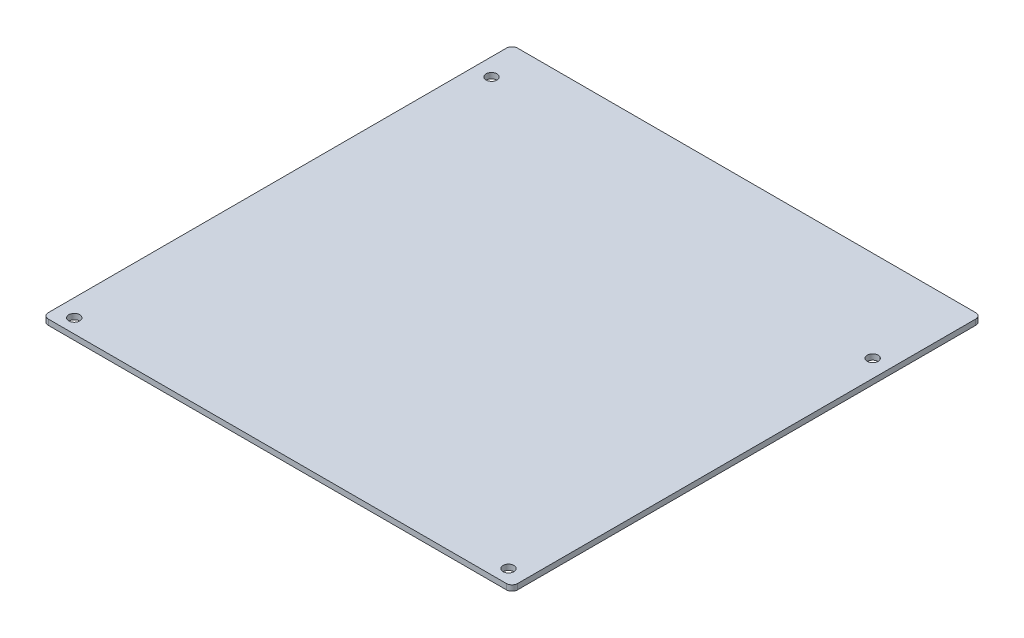
ISO-10303-21;
HEADER;
FILE_DESCRIPTION(('STEP AP214'),'2;1');
FILE_NAME('part.step','',(''),(''),'','','');
FILE_SCHEMA(('AUTOMOTIVE_DESIGN { 1 0 10303 214 1 1 1 1 }'));
ENDSEC;
DATA;
#1=APPLICATION_CONTEXT('core data for automotive mechanical design processes');
#2=APPLICATION_PROTOCOL_DEFINITION('international standard','automotive_design',2000,#1);
#3=PRODUCT_CONTEXT('',#1,'mechanical');
#4=PRODUCT('Part','Part','',(#3));
#5=PRODUCT_RELATED_PRODUCT_CATEGORY('part','',(#4));
#6=PRODUCT_DEFINITION_FORMATION('','',#4);
#7=PRODUCT_DEFINITION_CONTEXT('part definition',#1,'design');
#8=PRODUCT_DEFINITION('design','',#6,#7);
#9=PRODUCT_DEFINITION_SHAPE('','',#8);
#10=(LENGTH_UNIT() NAMED_UNIT(*) SI_UNIT(.MILLI.,.METRE.));
#11=(NAMED_UNIT(*) PLANE_ANGLE_UNIT() SI_UNIT($,.RADIAN.));
#12=(NAMED_UNIT(*) SI_UNIT($,.STERADIAN.) SOLID_ANGLE_UNIT());
#13=UNCERTAINTY_MEASURE_WITH_UNIT(LENGTH_MEASURE(1.E-05),#10,'distance_accuracy_value','');
#14=(GEOMETRIC_REPRESENTATION_CONTEXT(3) GLOBAL_UNCERTAINTY_ASSIGNED_CONTEXT((#13)) GLOBAL_UNIT_ASSIGNED_CONTEXT((#10,
#11,#12)) REPRESENTATION_CONTEXT('',''));
#15=CARTESIAN_POINT('',(0.,0.,0.));
#16=DIRECTION('',(0.,0.,1.));
#17=DIRECTION('',(1.,0.,0.));
#18=AXIS2_PLACEMENT_3D('',#15,#16,#17);
#19=CARTESIAN_POINT('',(85.09,2.,85.09));
#20=DIRECTION('',(-1.,0.,0.));
#21=DIRECTION('',(0.,0.,1.));
#22=AXIS2_PLACEMENT_3D('',#19,#20,#21);
#23=PLANE('',#22);
#24=DIRECTION('',(0.,0.,-1.));
#25=VECTOR('',#24,1.);
#26=CARTESIAN_POINT('',(85.09,0.,85.09));
#27=LINE('',#26,#25);
#28=CARTESIAN_POINT('',(85.09,0.,83.09));
#29=VERTEX_POINT('',#28);
#30=CARTESIAN_POINT('',(85.09,0.,-83.09));
#31=VERTEX_POINT('',#30);
#32=EDGE_CURVE('E128',#29,#31,#27,.T.);
#33=ORIENTED_EDGE('',*,*,#32,.T.);
#34=DIRECTION('',(0.,-1.,0.));
#35=VECTOR('',#34,1.);
#36=CARTESIAN_POINT('',(85.09,2.,-83.09));
#37=LINE('',#36,#35);
#38=CARTESIAN_POINT('',(85.09,2.,-83.09));
#39=VERTEX_POINT('',#38);
#40=EDGE_CURVE('E151',#31,#39,#37,.F.);
#41=ORIENTED_EDGE('',*,*,#40,.T.);
#42=DIRECTION('',(0.,0.,-1.));
#43=VECTOR('',#42,1.);
#44=CARTESIAN_POINT('',(85.09,2.,85.09));
#45=LINE('',#44,#43);
#46=CARTESIAN_POINT('',(85.09,2.,83.09));
#47=VERTEX_POINT('',#46);
#48=EDGE_CURVE('E126',#47,#39,#45,.T.);
#49=ORIENTED_EDGE('',*,*,#48,.F.);
#50=DIRECTION('',(0.,-1.,0.));
#51=VECTOR('',#50,1.);
#52=CARTESIAN_POINT('',(85.09,2.,83.09));
#53=LINE('',#52,#51);
#54=EDGE_CURVE('E148',#47,#29,#53,.T.);
#55=ORIENTED_EDGE('',*,*,#54,.T.);
#56=EDGE_LOOP('',(#33,#41,#49,#55));
#57=FACE_BOUND('',#56,.T.);
#58=ADVANCED_FACE('F33',(#57),#23,.F.);
#59=CARTESIAN_POINT('',(-85.09,2.,-85.09));
#60=DIRECTION('',(0.,0.,1.));
#61=DIRECTION('',(1.,0.,0.));
#62=AXIS2_PLACEMENT_3D('',#59,#60,#61);
#63=PLANE('',#62);
#64=DIRECTION('',(-1.,0.,0.));
#65=VECTOR('',#64,1.);
#66=CARTESIAN_POINT('',(-85.09,0.,-85.09));
#67=LINE('',#66,#65);
#68=CARTESIAN_POINT('',(83.09,0.,-85.09));
#69=VERTEX_POINT('',#68);
#70=CARTESIAN_POINT('',(-83.09,0.,-85.09));
#71=VERTEX_POINT('',#70);
#72=EDGE_CURVE('E124',#69,#71,#67,.T.);
#73=ORIENTED_EDGE('',*,*,#72,.T.);
#74=DIRECTION('',(0.,-1.,0.));
#75=VECTOR('',#74,1.);
#76=CARTESIAN_POINT('',(-83.09,2.,-85.09));
#77=LINE('',#76,#75);
#78=CARTESIAN_POINT('',(-83.09,2.,-85.09));
#79=VERTEX_POINT('',#78);
#80=EDGE_CURVE('E103',#71,#79,#77,.F.);
#81=ORIENTED_EDGE('',*,*,#80,.T.);
#82=DIRECTION('',(-1.,0.,0.));
#83=VECTOR('',#82,1.);
#84=CARTESIAN_POINT('',(-85.09,2.,-85.09));
#85=LINE('',#84,#83);
#86=CARTESIAN_POINT('',(83.09,2.,-85.09));
#87=VERTEX_POINT('',#86);
#88=EDGE_CURVE('E167',#87,#79,#85,.T.);
#89=ORIENTED_EDGE('',*,*,#88,.F.);
#90=DIRECTION('',(0.,-1.,0.));
#91=VECTOR('',#90,1.);
#92=CARTESIAN_POINT('',(83.09,2.,-85.09));
#93=LINE('',#92,#91);
#94=EDGE_CURVE('E108',#87,#69,#93,.T.);
#95=ORIENTED_EDGE('',*,*,#94,.T.);
#96=EDGE_LOOP('',(#73,#81,#89,#95));
#97=FACE_BOUND('',#96,.T.);
#98=ADVANCED_FACE('F212',(#97),#63,.F.);
#99=CARTESIAN_POINT('',(-85.09,2.,85.09));
#100=DIRECTION('',(1.,0.,0.));
#101=DIRECTION('',(0.,0.,-1.));
#102=AXIS2_PLACEMENT_3D('',#99,#100,#101);
#103=PLANE('',#102);
#104=DIRECTION('',(0.,0.,1.));
#105=VECTOR('',#104,1.);
#106=CARTESIAN_POINT('',(-85.09,2.,85.09));
#107=LINE('',#106,#105);
#108=CARTESIAN_POINT('',(-85.09,2.,-83.09));
#109=VERTEX_POINT('',#108);
#110=CARTESIAN_POINT('',(-85.09,2.,83.09));
#111=VERTEX_POINT('',#110);
#112=EDGE_CURVE('E117',#109,#111,#107,.T.);
#113=ORIENTED_EDGE('',*,*,#112,.F.);
#114=DIRECTION('',(0.,-1.,0.));
#115=VECTOR('',#114,1.);
#116=CARTESIAN_POINT('',(-85.09,2.,-83.09));
#117=LINE('',#116,#115);
#118=CARTESIAN_POINT('',(-85.09,0.,-83.09));
#119=VERTEX_POINT('',#118);
#120=EDGE_CURVE('E102',#109,#119,#117,.T.);
#121=ORIENTED_EDGE('',*,*,#120,.T.);
#122=DIRECTION('',(0.,0.,1.));
#123=VECTOR('',#122,1.);
#124=CARTESIAN_POINT('',(-85.09,0.,85.09));
#125=LINE('',#124,#123);
#126=CARTESIAN_POINT('',(-85.09,0.,83.09));
#127=VERTEX_POINT('',#126);
#128=EDGE_CURVE('E115',#119,#127,#125,.T.);
#129=ORIENTED_EDGE('',*,*,#128,.T.);
#130=DIRECTION('',(0.,-1.,0.));
#131=VECTOR('',#130,1.);
#132=CARTESIAN_POINT('',(-85.09,2.,83.09));
#133=LINE('',#132,#131);
#134=EDGE_CURVE('E119',#127,#111,#133,.F.);
#135=ORIENTED_EDGE('',*,*,#134,.T.);
#136=EDGE_LOOP('',(#113,#121,#129,#135));
#137=FACE_BOUND('',#136,.T.);
#138=ADVANCED_FACE('F114',(#137),#103,.F.);
#139=CARTESIAN_POINT('',(-85.09,2.,85.09));
#140=DIRECTION('',(0.,0.,-1.));
#141=DIRECTION('',(-1.,0.,0.));
#142=AXIS2_PLACEMENT_3D('',#139,#140,#141);
#143=PLANE('',#142);
#144=DIRECTION('',(1.,0.,0.));
#145=VECTOR('',#144,1.);
#146=CARTESIAN_POINT('',(-85.09,0.,85.09));
#147=LINE('',#146,#145);
#148=CARTESIAN_POINT('',(-83.09,0.,85.09));
#149=VERTEX_POINT('',#148);
#150=CARTESIAN_POINT('',(83.09,0.,85.09));
#151=VERTEX_POINT('',#150);
#152=EDGE_CURVE('E123',#149,#151,#147,.T.);
#153=ORIENTED_EDGE('',*,*,#152,.T.);
#154=DIRECTION('',(0.,-1.,0.));
#155=VECTOR('',#154,1.);
#156=CARTESIAN_POINT('',(83.09,2.,85.09));
#157=LINE('',#156,#155);
#158=CARTESIAN_POINT('',(83.09,2.,85.09));
#159=VERTEX_POINT('',#158);
#160=EDGE_CURVE('E11',#151,#159,#157,.F.);
#161=ORIENTED_EDGE('',*,*,#160,.T.);
#162=DIRECTION('',(1.,0.,0.));
#163=VECTOR('',#162,1.);
#164=CARTESIAN_POINT('',(-85.09,2.,85.09));
#165=LINE('',#164,#163);
#166=CARTESIAN_POINT('',(-83.09,2.,85.09));
#167=VERTEX_POINT('',#166);
#168=EDGE_CURVE('E132',#167,#159,#165,.T.);
#169=ORIENTED_EDGE('',*,*,#168,.F.);
#170=DIRECTION('',(0.,-1.,0.));
#171=VECTOR('',#170,1.);
#172=CARTESIAN_POINT('',(-83.09,2.,85.09));
#173=LINE('',#172,#171);
#174=EDGE_CURVE('E41',#167,#149,#173,.T.);
#175=ORIENTED_EDGE('',*,*,#174,.T.);
#176=EDGE_LOOP('',(#153,#161,#169,#175));
#177=FACE_BOUND('',#176,.T.);
#178=ADVANCED_FACE('F154',(#177),#143,.F.);
#179=CARTESIAN_POINT('',(0.,2.,0.));
#180=DIRECTION('',(0.,-1.,0.));
#181=DIRECTION('',(0.,0.,-1.));
#182=AXIS2_PLACEMENT_3D('',#179,#180,#181);
#183=PLANE('',#182);
#184=CARTESIAN_POINT('',(-78.74,2.,-71.3215962110521));
#185=DIRECTION('',(0.,1.,0.));
#186=DIRECTION('',(0.,0.,1.));
#187=AXIS2_PLACEMENT_3D('',#184,#185,#186);
#188=CIRCLE('',#187,1.97500000000001);
#189=CARTESIAN_POINT('',(-78.74,2.,-69.3465962110521));
#190=VERTEX_POINT('',#189);
#191=EDGE_CURVE('E178',#190,#190,#188,.T.);
#192=ORIENTED_EDGE('',*,*,#191,.F.);
#193=EDGE_LOOP('',(#192));
#194=FACE_BOUND('',#193,.T.);
#195=CARTESIAN_POINT('',(78.74,2.,-52.07));
#196=DIRECTION('',(0.,1.,0.));
#197=DIRECTION('',(0.,0.,1.));
#198=AXIS2_PLACEMENT_3D('',#195,#196,#197);
#199=CIRCLE('',#198,1.97500000000001);
#200=CARTESIAN_POINT('',(78.74,2.,-50.095));
#201=VERTEX_POINT('',#200);
#202=EDGE_CURVE('E188',#201,#201,#199,.T.);
#203=ORIENTED_EDGE('',*,*,#202,.F.);
#204=EDGE_LOOP('',(#203));
#205=FACE_BOUND('',#204,.T.);
#206=CARTESIAN_POINT('',(78.74,2.,80.01));
#207=DIRECTION('',(0.,1.,0.));
#208=DIRECTION('',(0.,0.,1.));
#209=AXIS2_PLACEMENT_3D('',#206,#207,#208);
#210=CIRCLE('',#209,1.97500000000001);
#211=CARTESIAN_POINT('',(78.74,2.,81.985));
#212=VERTEX_POINT('',#211);
#213=EDGE_CURVE('E194',#212,#212,#210,.T.);
#214=ORIENTED_EDGE('',*,*,#213,.F.);
#215=EDGE_LOOP('',(#214));
#216=FACE_BOUND('',#215,.T.);
#217=CARTESIAN_POINT('',(-78.74,2.,80.01));
#218=DIRECTION('',(0.,1.,0.));
#219=DIRECTION('',(0.,0.,1.));
#220=AXIS2_PLACEMENT_3D('',#217,#218,#219);
#221=CIRCLE('',#220,1.97500000000001);
#222=CARTESIAN_POINT('',(-78.74,2.,81.985));
#223=VERTEX_POINT('',#222);
#224=EDGE_CURVE('E172',#223,#223,#221,.T.);
#225=ORIENTED_EDGE('',*,*,#224,.F.);
#226=EDGE_LOOP('',(#225));
#227=FACE_BOUND('',#226,.T.);
#228=ORIENTED_EDGE('',*,*,#88,.T.);
#229=CARTESIAN_POINT('',(-83.09,2.,-83.09));
#230=DIRECTION('',(0.,-1.,0.));
#231=DIRECTION('',(0.,0.,-1.));
#232=AXIS2_PLACEMENT_3D('',#229,#230,#231);
#233=CIRCLE('',#232,2.);
#234=EDGE_CURVE('E146',#79,#109,#233,.F.);
#235=ORIENTED_EDGE('',*,*,#234,.T.);
#236=ORIENTED_EDGE('',*,*,#112,.T.);
#237=CARTESIAN_POINT('',(-83.09,2.,83.09));
#238=DIRECTION('',(0.,-1.,0.));
#239=DIRECTION('',(0.,0.,-1.));
#240=AXIS2_PLACEMENT_3D('',#237,#238,#239);
#241=CIRCLE('',#240,2.);
#242=EDGE_CURVE('E53',#111,#167,#241,.F.);
#243=ORIENTED_EDGE('',*,*,#242,.T.);
#244=ORIENTED_EDGE('',*,*,#168,.T.);
#245=CARTESIAN_POINT('',(83.09,2.,83.09));
#246=DIRECTION('',(0.,-1.,0.));
#247=DIRECTION('',(0.,0.,-1.));
#248=AXIS2_PLACEMENT_3D('',#245,#246,#247);
#249=CIRCLE('',#248,2.);
#250=EDGE_CURVE('E142',#159,#47,#249,.F.);
#251=ORIENTED_EDGE('',*,*,#250,.T.);
#252=ORIENTED_EDGE('',*,*,#48,.T.);
#253=CARTESIAN_POINT('',(83.09,2.,-83.09));
#254=DIRECTION('',(0.,-1.,0.));
#255=DIRECTION('',(0.,0.,-1.));
#256=AXIS2_PLACEMENT_3D('',#253,#254,#255);
#257=CIRCLE('',#256,2.);
#258=EDGE_CURVE('E144',#39,#87,#257,.F.);
#259=ORIENTED_EDGE('',*,*,#258,.T.);
#260=EDGE_LOOP('',(#228,#235,#236,#243,#244,#251,#252,#259));
#261=FACE_BOUND('',#260,.T.);
#262=ADVANCED_FACE('F205',(#194,#205,#216,#227,#261),#183,.F.);
#263=CARTESIAN_POINT('',(0.,0.,0.));
#264=DIRECTION('',(0.,-1.,0.));
#265=DIRECTION('',(0.,0.,-1.));
#266=AXIS2_PLACEMENT_3D('',#263,#264,#265);
#267=PLANE('',#266);
#268=CARTESIAN_POINT('',(-78.74,0.,-71.3215962110521));
#269=DIRECTION('',(0.,1.,0.));
#270=DIRECTION('',(0.,0.,1.));
#271=AXIS2_PLACEMENT_3D('',#268,#269,#270);
#272=CIRCLE('',#271,1.97500000000001);
#273=CARTESIAN_POINT('',(-78.74,0.,-69.3465962110521));
#274=VERTEX_POINT('',#273);
#275=EDGE_CURVE('E176',#274,#274,#272,.T.);
#276=ORIENTED_EDGE('',*,*,#275,.T.);
#277=EDGE_LOOP('',(#276));
#278=FACE_BOUND('',#277,.T.);
#279=CARTESIAN_POINT('',(78.74,0.,-52.07));
#280=DIRECTION('',(0.,1.,0.));
#281=DIRECTION('',(0.,0.,1.));
#282=AXIS2_PLACEMENT_3D('',#279,#280,#281);
#283=CIRCLE('',#282,1.97500000000001);
#284=CARTESIAN_POINT('',(78.74,0.,-50.095));
#285=VERTEX_POINT('',#284);
#286=EDGE_CURVE('E183',#285,#285,#283,.T.);
#287=ORIENTED_EDGE('',*,*,#286,.T.);
#288=EDGE_LOOP('',(#287));
#289=FACE_BOUND('',#288,.T.);
#290=CARTESIAN_POINT('',(78.74,0.,80.01));
#291=DIRECTION('',(0.,1.,0.));
#292=DIRECTION('',(0.,0.,1.));
#293=AXIS2_PLACEMENT_3D('',#290,#291,#292);
#294=CIRCLE('',#293,1.97500000000001);
#295=CARTESIAN_POINT('',(78.74,0.,81.985));
#296=VERTEX_POINT('',#295);
#297=EDGE_CURVE('E191',#296,#296,#294,.T.);
#298=ORIENTED_EDGE('',*,*,#297,.T.);
#299=EDGE_LOOP('',(#298));
#300=FACE_BOUND('',#299,.T.);
#301=CARTESIAN_POINT('',(-78.74,0.,80.01));
#302=DIRECTION('',(0.,1.,0.));
#303=DIRECTION('',(0.,0.,1.));
#304=AXIS2_PLACEMENT_3D('',#301,#302,#303);
#305=CIRCLE('',#304,1.97500000000001);
#306=CARTESIAN_POINT('',(-78.74,0.,81.985));
#307=VERTEX_POINT('',#306);
#308=EDGE_CURVE('E196',#307,#307,#305,.T.);
#309=ORIENTED_EDGE('',*,*,#308,.T.);
#310=EDGE_LOOP('',(#309));
#311=FACE_BOUND('',#310,.T.);
#312=ORIENTED_EDGE('',*,*,#128,.F.);
#313=CARTESIAN_POINT('',(-83.09,0.,-83.09));
#314=DIRECTION('',(0.,-1.,0.));
#315=DIRECTION('',(0.,0.,-1.));
#316=AXIS2_PLACEMENT_3D('',#313,#314,#315);
#317=CIRCLE('',#316,2.);
#318=EDGE_CURVE('E98',#119,#71,#317,.T.);
#319=ORIENTED_EDGE('',*,*,#318,.T.);
#320=ORIENTED_EDGE('',*,*,#72,.F.);
#321=CARTESIAN_POINT('',(83.09,0.,-83.09));
#322=DIRECTION('',(0.,-1.,0.));
#323=DIRECTION('',(0.,0.,-1.));
#324=AXIS2_PLACEMENT_3D('',#321,#322,#323);
#325=CIRCLE('',#324,2.);
#326=EDGE_CURVE('E109',#69,#31,#325,.T.);
#327=ORIENTED_EDGE('',*,*,#326,.T.);
#328=ORIENTED_EDGE('',*,*,#32,.F.);
#329=CARTESIAN_POINT('',(83.09,0.,83.09));
#330=DIRECTION('',(0.,-1.,0.));
#331=DIRECTION('',(0.,0.,-1.));
#332=AXIS2_PLACEMENT_3D('',#329,#330,#331);
#333=CIRCLE('',#332,2.);
#334=EDGE_CURVE('E135',#29,#151,#333,.T.);
#335=ORIENTED_EDGE('',*,*,#334,.T.);
#336=ORIENTED_EDGE('',*,*,#152,.F.);
#337=CARTESIAN_POINT('',(-83.09,0.,83.09));
#338=DIRECTION('',(0.,-1.,0.));
#339=DIRECTION('',(0.,0.,-1.));
#340=AXIS2_PLACEMENT_3D('',#337,#338,#339);
#341=CIRCLE('',#340,2.);
#342=EDGE_CURVE('E118',#149,#127,#341,.T.);
#343=ORIENTED_EDGE('',*,*,#342,.T.);
#344=EDGE_LOOP('',(#312,#319,#320,#327,#328,#335,#336,#343));
#345=FACE_BOUND('',#344,.T.);
#346=ADVANCED_FACE('F121',(#278,#289,#300,#311,#345),#267,.T.);
#347=CARTESIAN_POINT('',(-83.09,2.,-83.09));
#348=DIRECTION('',(0.,-1.,0.));
#349=DIRECTION('',(0.,0.,-1.));
#350=AXIS2_PLACEMENT_3D('',#347,#348,#349);
#351=CYLINDRICAL_SURFACE('',#350,2.);
#352=ORIENTED_EDGE('',*,*,#234,.F.);
#353=ORIENTED_EDGE('',*,*,#80,.F.);
#354=ORIENTED_EDGE('',*,*,#318,.F.);
#355=ORIENTED_EDGE('',*,*,#120,.F.);
#356=EDGE_LOOP('',(#352,#353,#354,#355));
#357=FACE_BOUND('',#356,.T.);
#358=ADVANCED_FACE('F101',(#357),#351,.T.);
#359=CARTESIAN_POINT('',(83.09,2.,-83.09));
#360=DIRECTION('',(0.,-1.,0.));
#361=DIRECTION('',(0.,0.,-1.));
#362=AXIS2_PLACEMENT_3D('',#359,#360,#361);
#363=CYLINDRICAL_SURFACE('',#362,2.);
#364=ORIENTED_EDGE('',*,*,#258,.F.);
#365=ORIENTED_EDGE('',*,*,#40,.F.);
#366=ORIENTED_EDGE('',*,*,#326,.F.);
#367=ORIENTED_EDGE('',*,*,#94,.F.);
#368=EDGE_LOOP('',(#364,#365,#366,#367));
#369=FACE_BOUND('',#368,.T.);
#370=ADVANCED_FACE('F214',(#369),#363,.T.);
#371=CARTESIAN_POINT('',(83.09,2.,83.09));
#372=DIRECTION('',(0.,-1.,0.));
#373=DIRECTION('',(0.,0.,-1.));
#374=AXIS2_PLACEMENT_3D('',#371,#372,#373);
#375=CYLINDRICAL_SURFACE('',#374,2.);
#376=ORIENTED_EDGE('',*,*,#250,.F.);
#377=ORIENTED_EDGE('',*,*,#160,.F.);
#378=ORIENTED_EDGE('',*,*,#334,.F.);
#379=ORIENTED_EDGE('',*,*,#54,.F.);
#380=EDGE_LOOP('',(#376,#377,#378,#379));
#381=FACE_BOUND('',#380,.T.);
#382=ADVANCED_FACE('F161',(#381),#375,.T.);
#383=CARTESIAN_POINT('',(-83.09,2.,83.09));
#384=DIRECTION('',(0.,-1.,0.));
#385=DIRECTION('',(0.,0.,-1.));
#386=AXIS2_PLACEMENT_3D('',#383,#384,#385);
#387=CYLINDRICAL_SURFACE('',#386,2.);
#388=ORIENTED_EDGE('',*,*,#242,.F.);
#389=ORIENTED_EDGE('',*,*,#134,.F.);
#390=ORIENTED_EDGE('',*,*,#342,.F.);
#391=ORIENTED_EDGE('',*,*,#174,.F.);
#392=EDGE_LOOP('',(#388,#389,#390,#391));
#393=FACE_BOUND('',#392,.T.);
#394=ADVANCED_FACE('F35',(#393),#387,.T.);
#395=CARTESIAN_POINT('',(-78.74,0.,80.01));
#396=DIRECTION('',(0.,1.,0.));
#397=DIRECTION('',(0.,0.,1.));
#398=AXIS2_PLACEMENT_3D('',#395,#396,#397);
#399=CYLINDRICAL_SURFACE('',#398,1.97500000000001);
#400=ORIENTED_EDGE('',*,*,#308,.F.);
#401=EDGE_LOOP('',(#400));
#402=FACE_BOUND('',#401,.T.);
#403=ORIENTED_EDGE('',*,*,#224,.T.);
#404=EDGE_LOOP('',(#403));
#405=FACE_BOUND('',#404,.T.);
#406=ADVANCED_FACE('F203',(#402,#405),#399,.F.);
#407=CARTESIAN_POINT('',(78.74,0.,80.01));
#408=DIRECTION('',(0.,1.,0.));
#409=DIRECTION('',(0.,0.,1.));
#410=AXIS2_PLACEMENT_3D('',#407,#408,#409);
#411=CYLINDRICAL_SURFACE('',#410,1.97500000000001);
#412=ORIENTED_EDGE('',*,*,#297,.F.);
#413=EDGE_LOOP('',(#412));
#414=FACE_BOUND('',#413,.T.);
#415=ORIENTED_EDGE('',*,*,#213,.T.);
#416=EDGE_LOOP('',(#415));
#417=FACE_BOUND('',#416,.T.);
#418=ADVANCED_FACE('F237',(#414,#417),#411,.F.);
#419=CARTESIAN_POINT('',(78.74,0.,-52.07));
#420=DIRECTION('',(0.,1.,0.));
#421=DIRECTION('',(0.,0.,1.));
#422=AXIS2_PLACEMENT_3D('',#419,#420,#421);
#423=CYLINDRICAL_SURFACE('',#422,1.97500000000001);
#424=ORIENTED_EDGE('',*,*,#286,.F.);
#425=EDGE_LOOP('',(#424));
#426=FACE_BOUND('',#425,.T.);
#427=ORIENTED_EDGE('',*,*,#202,.T.);
#428=EDGE_LOOP('',(#427));
#429=FACE_BOUND('',#428,.T.);
#430=ADVANCED_FACE('F241',(#426,#429),#423,.F.);
#431=CARTESIAN_POINT('',(-78.74,0.,-71.3215962110521));
#432=DIRECTION('',(0.,1.,0.));
#433=DIRECTION('',(0.,0.,1.));
#434=AXIS2_PLACEMENT_3D('',#431,#432,#433);
#435=CYLINDRICAL_SURFACE('',#434,1.97500000000001);
#436=ORIENTED_EDGE('',*,*,#275,.F.);
#437=EDGE_LOOP('',(#436));
#438=FACE_BOUND('',#437,.T.);
#439=ORIENTED_EDGE('',*,*,#191,.T.);
#440=EDGE_LOOP('',(#439));
#441=FACE_BOUND('',#440,.T.);
#442=ADVANCED_FACE('F245',(#438,#441),#435,.F.);
#443=CLOSED_SHELL('',(#58,#98,#138,#178,#262,#346,#358,#370,#382,#394,#406,#418,#430,#442));
#444=MANIFOLD_SOLID_BREP('B2',#443);
#445=ADVANCED_BREP_SHAPE_REPRESENTATION('',(#18,#444),#14);
#446=SHAPE_DEFINITION_REPRESENTATION(#9,#445);
ENDSEC;
END-ISO-10303-21;
